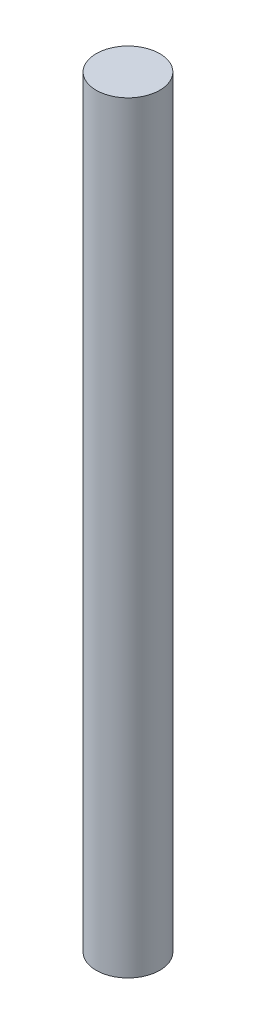
ISO-10303-21;
HEADER;
FILE_DESCRIPTION(('STEP AP214'),'2;1');
FILE_NAME('part.step','',(''),(''),'','','');
FILE_SCHEMA(('AUTOMOTIVE_DESIGN { 1 0 10303 214 1 1 1 1 }'));
ENDSEC;
DATA;
#1=APPLICATION_CONTEXT('core data for automotive mechanical design processes');
#2=APPLICATION_PROTOCOL_DEFINITION('international standard','automotive_design',2000,#1);
#3=PRODUCT_CONTEXT('',#1,'mechanical');
#4=PRODUCT('Part','Part','',(#3));
#5=PRODUCT_RELATED_PRODUCT_CATEGORY('part','',(#4));
#6=PRODUCT_DEFINITION_FORMATION('','',#4);
#7=PRODUCT_DEFINITION_CONTEXT('part definition',#1,'design');
#8=PRODUCT_DEFINITION('design','',#6,#7);
#9=PRODUCT_DEFINITION_SHAPE('','',#8);
#10=(LENGTH_UNIT() NAMED_UNIT(*) SI_UNIT(.MILLI.,.METRE.));
#11=(NAMED_UNIT(*) PLANE_ANGLE_UNIT() SI_UNIT($,.RADIAN.));
#12=(NAMED_UNIT(*) SI_UNIT($,.STERADIAN.) SOLID_ANGLE_UNIT());
#13=UNCERTAINTY_MEASURE_WITH_UNIT(LENGTH_MEASURE(1.E-05),#10,'distance_accuracy_value','');
#14=(GEOMETRIC_REPRESENTATION_CONTEXT(3) GLOBAL_UNCERTAINTY_ASSIGNED_CONTEXT((#13)) GLOBAL_UNIT_ASSIGNED_CONTEXT((#10,
#11,#12)) REPRESENTATION_CONTEXT('',''));
#15=CARTESIAN_POINT('',(0.,0.,0.));
#16=DIRECTION('',(0.,0.,1.));
#17=DIRECTION('',(1.,0.,0.));
#18=AXIS2_PLACEMENT_3D('',#15,#16,#17);
#19=CARTESIAN_POINT('',(0.,60.,0.));
#20=DIRECTION('',(0.,-1.,0.));
#21=DIRECTION('',(0.,0.,-1.));
#22=AXIS2_PLACEMENT_3D('',#19,#20,#21);
#23=CYLINDRICAL_SURFACE('',#22,2.5);
#24=CARTESIAN_POINT('',(0.,60.,0.));
#25=DIRECTION('',(0.,1.,0.));
#26=DIRECTION('',(0.,0.,1.));
#27=AXIS2_PLACEMENT_3D('',#24,#25,#26);
#28=CIRCLE('',#27,2.5);
#29=CARTESIAN_POINT('',(0.,60.,2.5));
#30=VERTEX_POINT('',#29);
#31=EDGE_CURVE('E10',#30,#30,#28,.T.);
#32=ORIENTED_EDGE('',*,*,#31,.F.);
#33=EDGE_LOOP('',(#32));
#34=FACE_BOUND('',#33,.T.);
#35=CARTESIAN_POINT('',(0.,0.,0.));
#36=DIRECTION('',(0.,1.,0.));
#37=DIRECTION('',(0.,0.,1.));
#38=AXIS2_PLACEMENT_3D('',#35,#36,#37);
#39=CIRCLE('',#38,2.5);
#40=CARTESIAN_POINT('',(0.,0.,2.5));
#41=VERTEX_POINT('',#40);
#42=EDGE_CURVE('E34',#41,#41,#39,.T.);
#43=ORIENTED_EDGE('',*,*,#42,.T.);
#44=EDGE_LOOP('',(#43));
#45=FACE_BOUND('',#44,.T.);
#46=ADVANCED_FACE('F31',(#34,#45),#23,.T.);
#47=CARTESIAN_POINT('',(0.,60.,0.));
#48=DIRECTION('',(0.,1.,0.));
#49=DIRECTION('',(0.,0.,1.));
#50=AXIS2_PLACEMENT_3D('',#47,#48,#49);
#51=PLANE('',#50);
#52=ORIENTED_EDGE('',*,*,#31,.T.);
#53=EDGE_LOOP('',(#52));
#54=FACE_BOUND('',#53,.T.);
#55=ADVANCED_FACE('F46',(#54),#51,.T.);
#56=CARTESIAN_POINT('',(0.,0.,0.));
#57=DIRECTION('',(0.,1.,0.));
#58=DIRECTION('',(0.,0.,1.));
#59=AXIS2_PLACEMENT_3D('',#56,#57,#58);
#60=PLANE('',#59);
#61=ORIENTED_EDGE('',*,*,#42,.F.);
#62=EDGE_LOOP('',(#61));
#63=FACE_BOUND('',#62,.T.);
#64=ADVANCED_FACE('F44',(#63),#60,.F.);
#65=CLOSED_SHELL('',(#46,#55,#64));
#66=MANIFOLD_SOLID_BREP('B2',#65);
#67=ADVANCED_BREP_SHAPE_REPRESENTATION('',(#18,#66),#14);
#68=SHAPE_DEFINITION_REPRESENTATION(#9,#67);
ENDSEC;
END-ISO-10303-21;
